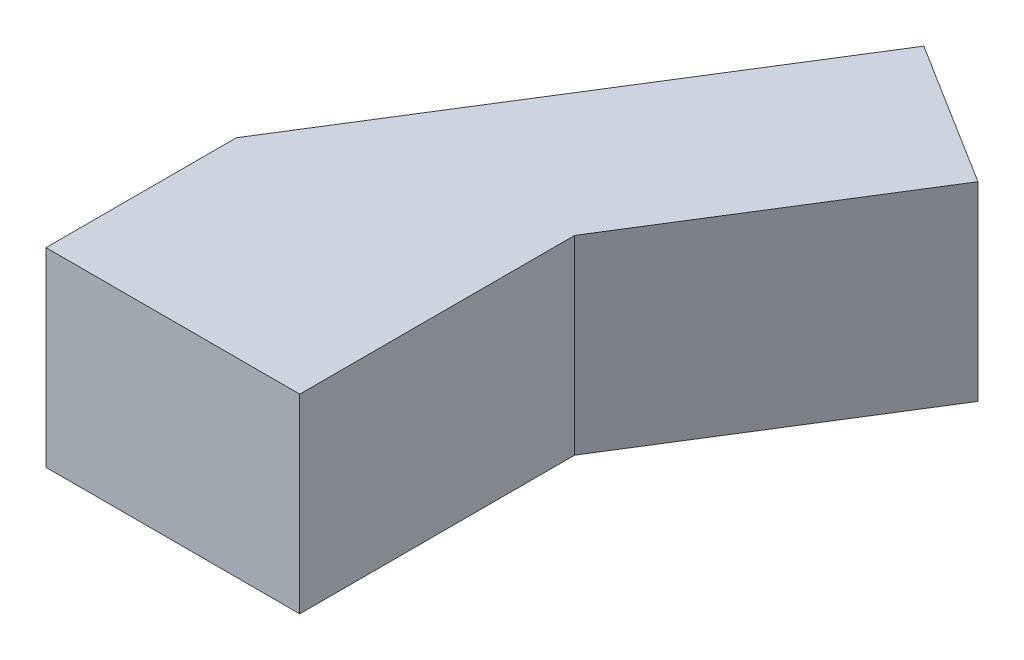
ISO-10303-21;
HEADER;
FILE_DESCRIPTION(('STEP AP214'),'2;1');
FILE_NAME('part.step','',(''),(''),'','','');
FILE_SCHEMA(('AUTOMOTIVE_DESIGN { 1 0 10303 214 1 1 1 1 }'));
ENDSEC;
DATA;
#1=APPLICATION_CONTEXT('core data for automotive mechanical design processes');
#2=APPLICATION_PROTOCOL_DEFINITION('international standard','automotive_design',2000,#1);
#3=PRODUCT_CONTEXT('',#1,'mechanical');
#4=PRODUCT('Part','Part','',(#3));
#5=PRODUCT_RELATED_PRODUCT_CATEGORY('part','',(#4));
#6=PRODUCT_DEFINITION_FORMATION('','',#4);
#7=PRODUCT_DEFINITION_CONTEXT('part definition',#1,'design');
#8=PRODUCT_DEFINITION('design','',#6,#7);
#9=PRODUCT_DEFINITION_SHAPE('','',#8);
#10=(LENGTH_UNIT() NAMED_UNIT(*) SI_UNIT(.MILLI.,.METRE.));
#11=(NAMED_UNIT(*) PLANE_ANGLE_UNIT() SI_UNIT($,.RADIAN.));
#12=(NAMED_UNIT(*) SI_UNIT($,.STERADIAN.) SOLID_ANGLE_UNIT());
#13=UNCERTAINTY_MEASURE_WITH_UNIT(LENGTH_MEASURE(1.E-05),#10,'distance_accuracy_value','');
#14=(GEOMETRIC_REPRESENTATION_CONTEXT(3) GLOBAL_UNCERTAINTY_ASSIGNED_CONTEXT((#13)) GLOBAL_UNIT_ASSIGNED_CONTEXT((#10,
#11,#12)) REPRESENTATION_CONTEXT('',''));
#15=CARTESIAN_POINT('',(0.,0.,0.));
#16=DIRECTION('',(0.,0.,1.));
#17=DIRECTION('',(1.,0.,0.));
#18=AXIS2_PLACEMENT_3D('',#15,#16,#17);
#19=CARTESIAN_POINT('',(0.,18.,0.));
#20=DIRECTION('',(1.,0.,0.));
#21=DIRECTION('',(0.,0.,-1.));
#22=AXIS2_PLACEMENT_3D('',#19,#20,#21);
#23=PLANE('',#22);
#24=DIRECTION('',(0.,0.,1.));
#25=VECTOR('',#24,1.);
#26=CARTESIAN_POINT('',(0.,0.,0.));
#27=LINE('',#26,#25);
#28=CARTESIAN_POINT('',(0.,0.,-18.));
#29=VERTEX_POINT('',#28);
#30=CARTESIAN_POINT('',(0.,0.,0.));
#31=VERTEX_POINT('',#30);
#32=EDGE_CURVE('E119',#29,#31,#27,.T.);
#33=ORIENTED_EDGE('',*,*,#32,.T.);
#34=DIRECTION('',(0.,-1.,0.));
#35=VECTOR('',#34,1.);
#36=CARTESIAN_POINT('',(0.,18.,0.));
#37=LINE('',#36,#35);
#38=CARTESIAN_POINT('',(0.,18.,0.));
#39=VERTEX_POINT('',#38);
#40=EDGE_CURVE('E11',#39,#31,#37,.T.);
#41=ORIENTED_EDGE('',*,*,#40,.F.);
#42=DIRECTION('',(0.,0.,1.));
#43=VECTOR('',#42,1.);
#44=CARTESIAN_POINT('',(0.,18.,0.));
#45=LINE('',#44,#43);
#46=CARTESIAN_POINT('',(0.,18.,-18.));
#47=VERTEX_POINT('',#46);
#48=EDGE_CURVE('E129',#47,#39,#45,.T.);
#49=ORIENTED_EDGE('',*,*,#48,.F.);
#50=DIRECTION('',(0.,-1.,0.));
#51=VECTOR('',#50,1.);
#52=CARTESIAN_POINT('',(0.,18.,-18.));
#53=LINE('',#52,#51);
#54=EDGE_CURVE('E115',#47,#29,#53,.T.);
#55=ORIENTED_EDGE('',*,*,#54,.T.);
#56=EDGE_LOOP('',(#33,#41,#49,#55));
#57=FACE_BOUND('',#56,.T.);
#58=ADVANCED_FACE('F35',(#57),#23,.F.);
#59=CARTESIAN_POINT('',(0.,18.,0.));
#60=DIRECTION('',(0.,0.,-1.));
#61=DIRECTION('',(-1.,0.,0.));
#62=AXIS2_PLACEMENT_3D('',#59,#60,#61);
#63=PLANE('',#62);
#64=DIRECTION('',(1.,0.,0.));
#65=VECTOR('',#64,1.);
#66=CARTESIAN_POINT('',(0.,0.,0.));
#67=LINE('',#66,#65);
#68=CARTESIAN_POINT('',(24.,0.,0.));
#69=VERTEX_POINT('',#68);
#70=EDGE_CURVE('E122',#31,#69,#67,.T.);
#71=ORIENTED_EDGE('',*,*,#70,.T.);
#72=DIRECTION('',(0.,-1.,0.));
#73=VECTOR('',#72,1.);
#74=CARTESIAN_POINT('',(24.,18.,0.));
#75=LINE('',#74,#73);
#76=CARTESIAN_POINT('',(24.,18.,0.));
#77=VERTEX_POINT('',#76);
#78=EDGE_CURVE('E43',#77,#69,#75,.T.);
#79=ORIENTED_EDGE('',*,*,#78,.F.);
#80=DIRECTION('',(1.,0.,0.));
#81=VECTOR('',#80,1.);
#82=CARTESIAN_POINT('',(0.,18.,0.));
#83=LINE('',#82,#81);
#84=EDGE_CURVE('E88',#39,#77,#83,.T.);
#85=ORIENTED_EDGE('',*,*,#84,.F.);
#86=ORIENTED_EDGE('',*,*,#40,.T.);
#87=EDGE_LOOP('',(#71,#79,#85,#86));
#88=FACE_BOUND('',#87,.T.);
#89=ADVANCED_FACE('F153',(#88),#63,.F.);
#90=CARTESIAN_POINT('',(24.,18.,0.));
#91=DIRECTION('',(-1.,0.,0.));
#92=DIRECTION('',(0.,0.,1.));
#93=AXIS2_PLACEMENT_3D('',#90,#91,#92);
#94=PLANE('',#93);
#95=DIRECTION('',(0.,0.,-1.));
#96=VECTOR('',#95,1.);
#97=CARTESIAN_POINT('',(24.,0.,0.));
#98=LINE('',#97,#96);
#99=CARTESIAN_POINT('',(24.,0.,-26.));
#100=VERTEX_POINT('',#99);
#101=EDGE_CURVE('E124',#69,#100,#98,.T.);
#102=ORIENTED_EDGE('',*,*,#101,.T.);
#103=DIRECTION('',(0.,-1.,0.));
#104=VECTOR('',#103,1.);
#105=CARTESIAN_POINT('',(24.,18.,-26.));
#106=LINE('',#105,#104);
#107=CARTESIAN_POINT('',(24.,18.,-26.));
#108=VERTEX_POINT('',#107);
#109=EDGE_CURVE('E110',#108,#100,#106,.T.);
#110=ORIENTED_EDGE('',*,*,#109,.F.);
#111=DIRECTION('',(0.,0.,-1.));
#112=VECTOR('',#111,1.);
#113=CARTESIAN_POINT('',(24.,18.,0.));
#114=LINE('',#113,#112);
#115=EDGE_CURVE('E101',#77,#108,#114,.T.);
#116=ORIENTED_EDGE('',*,*,#115,.F.);
#117=ORIENTED_EDGE('',*,*,#78,.T.);
#118=EDGE_LOOP('',(#102,#110,#116,#117));
#119=FACE_BOUND('',#118,.T.);
#120=ADVANCED_FACE('F135',(#119),#94,.F.);
#121=CARTESIAN_POINT('',(24.,18.,-26.));
#122=DIRECTION('',(-0.848048096156425,0.,-0.529919264233206));
#123=DIRECTION('',(-0.529919264233206,0.,0.848048096156425));
#124=AXIS2_PLACEMENT_3D('',#121,#122,#123);
#125=PLANE('',#124);
#126=DIRECTION('',(0.529919264233206,0.,-0.848048096156425));
#127=VECTOR('',#126,1.);
#128=CARTESIAN_POINT('',(24.,0.,-26.));
#129=LINE('',#128,#127);
#130=CARTESIAN_POINT('',(38.6727864204878,0.,-49.4813667459511));
#131=VERTEX_POINT('',#130);
#132=EDGE_CURVE('E109',#100,#131,#129,.T.);
#133=ORIENTED_EDGE('',*,*,#132,.T.);
#134=DIRECTION('',(0.,-1.,0.));
#135=VECTOR('',#134,1.);
#136=CARTESIAN_POINT('',(38.6727864204878,18.,-49.4813667459511));
#137=LINE('',#136,#135);
#138=CARTESIAN_POINT('',(38.6727864204878,18.,-49.4813667459511));
#139=VERTEX_POINT('',#138);
#140=EDGE_CURVE('E106',#139,#131,#137,.T.);
#141=ORIENTED_EDGE('',*,*,#140,.F.);
#142=DIRECTION('',(0.529919264233206,0.,-0.848048096156425));
#143=VECTOR('',#142,1.);
#144=CARTESIAN_POINT('',(24.,18.,-26.));
#145=LINE('',#144,#143);
#146=EDGE_CURVE('E95',#108,#139,#145,.T.);
#147=ORIENTED_EDGE('',*,*,#146,.F.);
#148=ORIENTED_EDGE('',*,*,#109,.T.);
#149=EDGE_LOOP('',(#133,#141,#147,#148));
#150=FACE_BOUND('',#149,.T.);
#151=ADVANCED_FACE('F107',(#150),#125,.F.);
#152=CARTESIAN_POINT('',(25.0075088442155,18.,-58.0203798886974));
#153=DIRECTION('',(-0.529919264233206,0.,0.848048096156425));
#154=DIRECTION('',(0.848048096156425,0.,0.529919264233206));
#155=AXIS2_PLACEMENT_3D('',#152,#153,#154);
#156=PLANE('',#155);
#157=DIRECTION('',(-0.848048096156425,0.,-0.529919264233206));
#158=VECTOR('',#157,1.);
#159=CARTESIAN_POINT('',(25.0075088442155,0.,-58.0203798886974));
#160=LINE('',#159,#158);
#161=CARTESIAN_POINT('',(25.0075088442155,0.,-58.0203798886974));
#162=VERTEX_POINT('',#161);
#163=EDGE_CURVE('E74',#131,#162,#160,.T.);
#164=ORIENTED_EDGE('',*,*,#163,.T.);
#165=DIRECTION('',(0.,-1.,0.));
#166=VECTOR('',#165,1.);
#167=CARTESIAN_POINT('',(25.0075088442155,18.,-58.0203798886974));
#168=LINE('',#167,#166);
#169=CARTESIAN_POINT('',(25.0075088442155,18.,-58.0203798886974));
#170=VERTEX_POINT('',#169);
#171=EDGE_CURVE('E111',#170,#162,#168,.T.);
#172=ORIENTED_EDGE('',*,*,#171,.F.);
#173=DIRECTION('',(-0.848048096156425,0.,-0.529919264233206));
#174=VECTOR('',#173,1.);
#175=CARTESIAN_POINT('',(25.0075088442155,18.,-58.0203798886974));
#176=LINE('',#175,#174);
#177=EDGE_CURVE('E99',#139,#170,#176,.T.);
#178=ORIENTED_EDGE('',*,*,#177,.F.);
#179=ORIENTED_EDGE('',*,*,#140,.T.);
#180=EDGE_LOOP('',(#164,#172,#178,#179));
#181=FACE_BOUND('',#180,.T.);
#182=ADVANCED_FACE('F113',(#181),#156,.F.);
#183=CARTESIAN_POINT('',(0.,18.,-18.));
#184=DIRECTION('',(0.848048096156425,0.,0.529919264233206));
#185=DIRECTION('',(0.529919264233206,0.,-0.848048096156425));
#186=AXIS2_PLACEMENT_3D('',#183,#184,#185);
#187=PLANE('',#186);
#188=DIRECTION('',(-0.529919264233206,0.,0.848048096156425));
#189=VECTOR('',#188,1.);
#190=CARTESIAN_POINT('',(0.,0.,-18.));
#191=LINE('',#190,#189);
#192=EDGE_CURVE('E80',#162,#29,#191,.T.);
#193=ORIENTED_EDGE('',*,*,#192,.T.);
#194=ORIENTED_EDGE('',*,*,#54,.F.);
#195=DIRECTION('',(-0.529919264233206,0.,0.848048096156425));
#196=VECTOR('',#195,1.);
#197=CARTESIAN_POINT('',(0.,18.,-18.));
#198=LINE('',#197,#196);
#199=EDGE_CURVE('E51',#170,#47,#198,.T.);
#200=ORIENTED_EDGE('',*,*,#199,.F.);
#201=ORIENTED_EDGE('',*,*,#171,.T.);
#202=EDGE_LOOP('',(#193,#194,#200,#201));
#203=FACE_BOUND('',#202,.T.);
#204=ADVANCED_FACE('F142',(#203),#187,.F.);
#205=CARTESIAN_POINT('',(0.,18.,0.));
#206=DIRECTION('',(0.,-1.,0.));
#207=DIRECTION('',(0.,0.,-1.));
#208=AXIS2_PLACEMENT_3D('',#205,#206,#207);
#209=PLANE('',#208);
#210=ORIENTED_EDGE('',*,*,#48,.T.);
#211=ORIENTED_EDGE('',*,*,#84,.T.);
#212=ORIENTED_EDGE('',*,*,#115,.T.);
#213=ORIENTED_EDGE('',*,*,#146,.T.);
#214=ORIENTED_EDGE('',*,*,#177,.T.);
#215=ORIENTED_EDGE('',*,*,#199,.T.);
#216=EDGE_LOOP('',(#210,#211,#212,#213,#214,#215));
#217=FACE_BOUND('',#216,.T.);
#218=ADVANCED_FACE('F97',(#217),#209,.F.);
#219=CARTESIAN_POINT('',(0.,0.,0.));
#220=DIRECTION('',(0.,-1.,0.));
#221=DIRECTION('',(0.,0.,-1.));
#222=AXIS2_PLACEMENT_3D('',#219,#220,#221);
#223=PLANE('',#222);
#224=ORIENTED_EDGE('',*,*,#32,.F.);
#225=ORIENTED_EDGE('',*,*,#192,.F.);
#226=ORIENTED_EDGE('',*,*,#163,.F.);
#227=ORIENTED_EDGE('',*,*,#132,.F.);
#228=ORIENTED_EDGE('',*,*,#101,.F.);
#229=ORIENTED_EDGE('',*,*,#70,.F.);
#230=EDGE_LOOP('',(#224,#225,#226,#227,#228,#229));
#231=FACE_BOUND('',#230,.T.);
#232=ADVANCED_FACE('F138',(#231),#223,.T.);
#233=CLOSED_SHELL('',(#58,#89,#120,#151,#182,#204,#218,#232));
#234=MANIFOLD_SOLID_BREP('B2',#233);
#235=ADVANCED_BREP_SHAPE_REPRESENTATION('',(#18,#234),#14);
#236=SHAPE_DEFINITION_REPRESENTATION(#9,#235);
ENDSEC;
END-ISO-10303-21;
